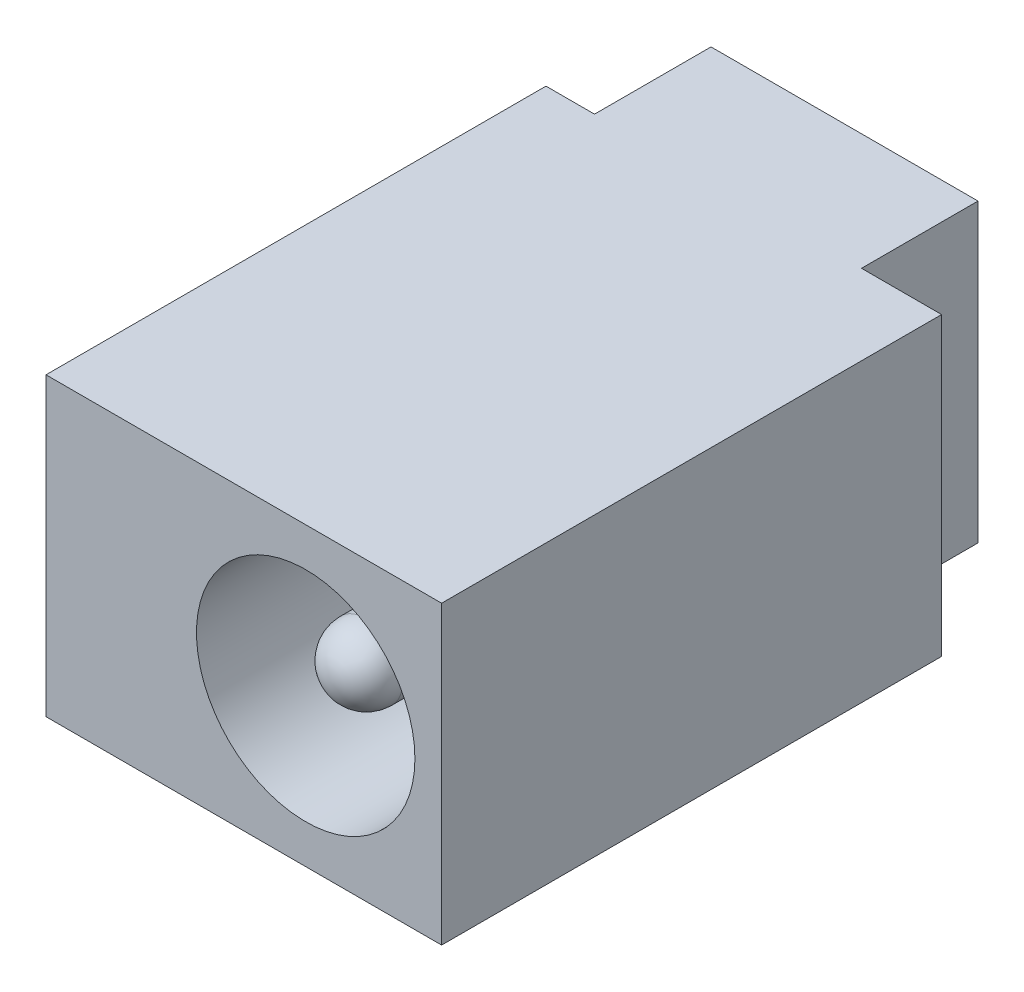
ISO-10303-21;
HEADER;
FILE_DESCRIPTION(('STEP AP214'),'2;1');
FILE_NAME('part.step','',(''),(''),'','','');
FILE_SCHEMA(('AUTOMOTIVE_DESIGN { 1 0 10303 214 1 1 1 1 }'));
ENDSEC;
DATA;
#1=APPLICATION_CONTEXT('core data for automotive mechanical design processes');
#2=APPLICATION_PROTOCOL_DEFINITION('international standard','automotive_design',2000,#1);
#3=PRODUCT_CONTEXT('',#1,'mechanical');
#4=PRODUCT('Part','Part','',(#3));
#5=PRODUCT_RELATED_PRODUCT_CATEGORY('part','',(#4));
#6=PRODUCT_DEFINITION_FORMATION('','',#4);
#7=PRODUCT_DEFINITION_CONTEXT('part definition',#1,'design');
#8=PRODUCT_DEFINITION('design','',#6,#7);
#9=PRODUCT_DEFINITION_SHAPE('','',#8);
#10=(LENGTH_UNIT() NAMED_UNIT(*) SI_UNIT(.MILLI.,.METRE.));
#11=(NAMED_UNIT(*) PLANE_ANGLE_UNIT() SI_UNIT($,.RADIAN.));
#12=(NAMED_UNIT(*) SI_UNIT($,.STERADIAN.) SOLID_ANGLE_UNIT());
#13=UNCERTAINTY_MEASURE_WITH_UNIT(LENGTH_MEASURE(1.E-05),#10,'distance_accuracy_value','');
#14=(GEOMETRIC_REPRESENTATION_CONTEXT(3) GLOBAL_UNCERTAINTY_ASSIGNED_CONTEXT((#13)) GLOBAL_UNIT_ASSIGNED_CONTEXT((#10,
#11,#12)) REPRESENTATION_CONTEXT('',''));
#15=CARTESIAN_POINT('',(0.,0.,0.));
#16=DIRECTION('',(0.,0.,1.));
#17=DIRECTION('',(1.,0.,0.));
#18=AXIS2_PLACEMENT_3D('',#15,#16,#17);
#19=CARTESIAN_POINT('',(4.075,6.1,6.35));
#20=DIRECTION('',(-1.,0.,0.));
#21=DIRECTION('',(0.,0.,1.));
#22=AXIS2_PLACEMENT_3D('',#19,#20,#21);
#23=PLANE('',#22);
#24=DIRECTION('',(0.,0.,-1.));
#25=VECTOR('',#24,1.);
#26=CARTESIAN_POINT('',(4.075,0.,6.35));
#27=LINE('',#26,#25);
#28=CARTESIAN_POINT('',(4.075,0.,6.35));
#29=VERTEX_POINT('',#28);
#30=CARTESIAN_POINT('',(4.075,0.,-3.95));
#31=VERTEX_POINT('',#30);
#32=EDGE_CURVE('E135',#29,#31,#27,.T.);
#33=ORIENTED_EDGE('',*,*,#32,.T.);
#34=DIRECTION('',(0.,-1.,0.));
#35=VECTOR('',#34,1.);
#36=CARTESIAN_POINT('',(4.075,6.1,-3.95));
#37=LINE('',#36,#35);
#38=CARTESIAN_POINT('',(4.075,6.1,-3.95));
#39=VERTEX_POINT('',#38);
#40=EDGE_CURVE('E46',#39,#31,#37,.T.);
#41=ORIENTED_EDGE('',*,*,#40,.F.);
#42=DIRECTION('',(0.,0.,-1.));
#43=VECTOR('',#42,1.);
#44=CARTESIAN_POINT('',(4.075,6.1,6.35));
#45=LINE('',#44,#43);
#46=CARTESIAN_POINT('',(4.075,6.1,6.35));
#47=VERTEX_POINT('',#46);
#48=EDGE_CURVE('E150',#47,#39,#45,.T.);
#49=ORIENTED_EDGE('',*,*,#48,.F.);
#50=DIRECTION('',(0.,-1.,0.));
#51=VECTOR('',#50,1.);
#52=CARTESIAN_POINT('',(4.075,6.1,6.35));
#53=LINE('',#52,#51);
#54=EDGE_CURVE('E131',#47,#29,#53,.T.);
#55=ORIENTED_EDGE('',*,*,#54,.T.);
#56=EDGE_LOOP('',(#33,#41,#49,#55));
#57=FACE_BOUND('',#56,.T.);
#58=ADVANCED_FACE('F37',(#57),#23,.F.);
#59=CARTESIAN_POINT('',(2.425,6.1,-3.95));
#60=DIRECTION('',(0.,0.,1.));
#61=DIRECTION('',(1.,0.,0.));
#62=AXIS2_PLACEMENT_3D('',#59,#60,#61);
#63=PLANE('',#62);
#64=DIRECTION('',(-1.,0.,0.));
#65=VECTOR('',#64,1.);
#66=CARTESIAN_POINT('',(2.425,0.,-3.95));
#67=LINE('',#66,#65);
#68=CARTESIAN_POINT('',(2.425,0.,-3.95));
#69=VERTEX_POINT('',#68);
#70=EDGE_CURVE('E138',#31,#69,#67,.T.);
#71=ORIENTED_EDGE('',*,*,#70,.T.);
#72=DIRECTION('',(0.,-1.,0.));
#73=VECTOR('',#72,1.);
#74=CARTESIAN_POINT('',(2.425,6.1,-3.95));
#75=LINE('',#74,#73);
#76=CARTESIAN_POINT('',(2.425,6.1,-3.95));
#77=VERTEX_POINT('',#76);
#78=EDGE_CURVE('E160',#77,#69,#75,.T.);
#79=ORIENTED_EDGE('',*,*,#78,.F.);
#80=DIRECTION('',(-1.,0.,0.));
#81=VECTOR('',#80,1.);
#82=CARTESIAN_POINT('',(2.425,6.1,-3.95));
#83=LINE('',#82,#81);
#84=EDGE_CURVE('E98',#39,#77,#83,.T.);
#85=ORIENTED_EDGE('',*,*,#84,.F.);
#86=ORIENTED_EDGE('',*,*,#40,.T.);
#87=EDGE_LOOP('',(#71,#79,#85,#86));
#88=FACE_BOUND('',#87,.T.);
#89=ADVANCED_FACE('F163',(#88),#63,.F.);
#90=CARTESIAN_POINT('',(2.425,6.1,-6.35));
#91=DIRECTION('',(-1.,0.,0.));
#92=DIRECTION('',(0.,0.,1.));
#93=AXIS2_PLACEMENT_3D('',#90,#91,#92);
#94=PLANE('',#93);
#95=DIRECTION('',(0.,0.,-1.));
#96=VECTOR('',#95,1.);
#97=CARTESIAN_POINT('',(2.425,0.,-6.35));
#98=LINE('',#97,#96);
#99=CARTESIAN_POINT('',(2.425,0.,-6.35));
#100=VERTEX_POINT('',#99);
#101=EDGE_CURVE('E141',#69,#100,#98,.T.);
#102=ORIENTED_EDGE('',*,*,#101,.T.);
#103=DIRECTION('',(0.,-1.,0.));
#104=VECTOR('',#103,1.);
#105=CARTESIAN_POINT('',(2.425,6.1,-6.35));
#106=LINE('',#105,#104);
#107=CARTESIAN_POINT('',(2.425,6.1,-6.35));
#108=VERTEX_POINT('',#107);
#109=EDGE_CURVE('E157',#108,#100,#106,.T.);
#110=ORIENTED_EDGE('',*,*,#109,.F.);
#111=DIRECTION('',(0.,0.,-1.));
#112=VECTOR('',#111,1.);
#113=CARTESIAN_POINT('',(2.425,6.1,-6.35));
#114=LINE('',#113,#112);
#115=EDGE_CURVE('E181',#77,#108,#114,.T.);
#116=ORIENTED_EDGE('',*,*,#115,.F.);
#117=ORIENTED_EDGE('',*,*,#78,.T.);
#118=EDGE_LOOP('',(#102,#110,#116,#117));
#119=FACE_BOUND('',#118,.T.);
#120=ADVANCED_FACE('F174',(#119),#94,.F.);
#121=CARTESIAN_POINT('',(2.425,6.1,-6.35));
#122=DIRECTION('',(0.,0.,1.));
#123=DIRECTION('',(1.,0.,0.));
#124=AXIS2_PLACEMENT_3D('',#121,#122,#123);
#125=PLANE('',#124);
#126=DIRECTION('',(-1.,0.,0.));
#127=VECTOR('',#126,1.);
#128=CARTESIAN_POINT('',(2.425,0.,-6.35));
#129=LINE('',#128,#127);
#130=CARTESIAN_POINT('',(-3.075,0.,-6.35));
#131=VERTEX_POINT('',#130);
#132=EDGE_CURVE('E143',#100,#131,#129,.T.);
#133=ORIENTED_EDGE('',*,*,#132,.T.);
#134=DIRECTION('',(0.,-1.,0.));
#135=VECTOR('',#134,1.);
#136=CARTESIAN_POINT('',(-3.075,6.1,-6.35));
#137=LINE('',#136,#135);
#138=CARTESIAN_POINT('',(-3.075,6.1,-6.35));
#139=VERTEX_POINT('',#138);
#140=EDGE_CURVE('E154',#139,#131,#137,.T.);
#141=ORIENTED_EDGE('',*,*,#140,.F.);
#142=DIRECTION('',(-1.,0.,0.));
#143=VECTOR('',#142,1.);
#144=CARTESIAN_POINT('',(2.425,6.1,-6.35));
#145=LINE('',#144,#143);
#146=EDGE_CURVE('E180',#108,#139,#145,.T.);
#147=ORIENTED_EDGE('',*,*,#146,.F.);
#148=ORIENTED_EDGE('',*,*,#109,.T.);
#149=EDGE_LOOP('',(#133,#141,#147,#148));
#150=FACE_BOUND('',#149,.T.);
#151=ADVANCED_FACE('F178',(#150),#125,.F.);
#152=CARTESIAN_POINT('',(-3.075,6.1,-3.95));
#153=DIRECTION('',(1.,0.,0.));
#154=DIRECTION('',(0.,0.,-1.));
#155=AXIS2_PLACEMENT_3D('',#152,#153,#154);
#156=PLANE('',#155);
#157=DIRECTION('',(0.,0.,1.));
#158=VECTOR('',#157,1.);
#159=CARTESIAN_POINT('',(-3.075,0.,-3.95));
#160=LINE('',#159,#158);
#161=CARTESIAN_POINT('',(-3.075,0.,-3.95));
#162=VERTEX_POINT('',#161);
#163=EDGE_CURVE('E145',#131,#162,#160,.T.);
#164=ORIENTED_EDGE('',*,*,#163,.T.);
#165=DIRECTION('',(0.,-1.,0.));
#166=VECTOR('',#165,1.);
#167=CARTESIAN_POINT('',(-3.075,6.1,-3.95));
#168=LINE('',#167,#166);
#169=CARTESIAN_POINT('',(-3.075,6.1,-3.95));
#170=VERTEX_POINT('',#169);
#171=EDGE_CURVE('E126',#170,#162,#168,.T.);
#172=ORIENTED_EDGE('',*,*,#171,.F.);
#173=DIRECTION('',(0.,0.,1.));
#174=VECTOR('',#173,1.);
#175=CARTESIAN_POINT('',(-3.075,6.1,-3.95));
#176=LINE('',#175,#174);
#177=EDGE_CURVE('E117',#139,#170,#176,.T.);
#178=ORIENTED_EDGE('',*,*,#177,.F.);
#179=ORIENTED_EDGE('',*,*,#140,.T.);
#180=EDGE_LOOP('',(#164,#172,#178,#179));
#181=FACE_BOUND('',#180,.T.);
#182=ADVANCED_FACE('F230',(#181),#156,.F.);
#183=CARTESIAN_POINT('',(-4.075,6.1,-3.95));
#184=DIRECTION('',(0.,0.,1.));
#185=DIRECTION('',(1.,0.,0.));
#186=AXIS2_PLACEMENT_3D('',#183,#184,#185);
#187=PLANE('',#186);
#188=DIRECTION('',(-1.,0.,0.));
#189=VECTOR('',#188,1.);
#190=CARTESIAN_POINT('',(-4.075,0.,-3.95));
#191=LINE('',#190,#189);
#192=CARTESIAN_POINT('',(-4.075,0.,-3.95));
#193=VERTEX_POINT('',#192);
#194=EDGE_CURVE('E125',#162,#193,#191,.T.);
#195=ORIENTED_EDGE('',*,*,#194,.T.);
#196=DIRECTION('',(0.,-1.,0.));
#197=VECTOR('',#196,1.);
#198=CARTESIAN_POINT('',(-4.075,6.1,-3.95));
#199=LINE('',#198,#197);
#200=CARTESIAN_POINT('',(-4.075,6.1,-3.95));
#201=VERTEX_POINT('',#200);
#202=EDGE_CURVE('E122',#201,#193,#199,.T.);
#203=ORIENTED_EDGE('',*,*,#202,.F.);
#204=DIRECTION('',(-1.,0.,0.));
#205=VECTOR('',#204,1.);
#206=CARTESIAN_POINT('',(-4.075,6.1,-3.95));
#207=LINE('',#206,#205);
#208=EDGE_CURVE('E111',#170,#201,#207,.T.);
#209=ORIENTED_EDGE('',*,*,#208,.F.);
#210=ORIENTED_EDGE('',*,*,#171,.T.);
#211=EDGE_LOOP('',(#195,#203,#209,#210));
#212=FACE_BOUND('',#211,.T.);
#213=ADVANCED_FACE('F123',(#212),#187,.F.);
#214=CARTESIAN_POINT('',(-4.075,6.1,6.35));
#215=DIRECTION('',(1.,0.,0.));
#216=DIRECTION('',(0.,0.,-1.));
#217=AXIS2_PLACEMENT_3D('',#214,#215,#216);
#218=PLANE('',#217);
#219=DIRECTION('',(0.,0.,1.));
#220=VECTOR('',#219,1.);
#221=CARTESIAN_POINT('',(-4.075,0.,6.35));
#222=LINE('',#221,#220);
#223=CARTESIAN_POINT('',(-4.075,0.,6.35));
#224=VERTEX_POINT('',#223);
#225=EDGE_CURVE('E83',#193,#224,#222,.T.);
#226=ORIENTED_EDGE('',*,*,#225,.T.);
#227=DIRECTION('',(0.,-1.,0.));
#228=VECTOR('',#227,1.);
#229=CARTESIAN_POINT('',(-4.075,6.1,6.35));
#230=LINE('',#229,#228);
#231=CARTESIAN_POINT('',(-4.075,6.1,6.35));
#232=VERTEX_POINT('',#231);
#233=EDGE_CURVE('E127',#232,#224,#230,.T.);
#234=ORIENTED_EDGE('',*,*,#233,.F.);
#235=DIRECTION('',(0.,0.,1.));
#236=VECTOR('',#235,1.);
#237=CARTESIAN_POINT('',(-4.075,6.1,6.35));
#238=LINE('',#237,#236);
#239=EDGE_CURVE('E115',#201,#232,#238,.T.);
#240=ORIENTED_EDGE('',*,*,#239,.F.);
#241=ORIENTED_EDGE('',*,*,#202,.T.);
#242=EDGE_LOOP('',(#226,#234,#240,#241));
#243=FACE_BOUND('',#242,.T.);
#244=ADVANCED_FACE('F129',(#243),#218,.F.);
#245=CARTESIAN_POINT('',(4.075,6.1,6.35));
#246=DIRECTION('',(0.,0.,-1.));
#247=DIRECTION('',(-1.,0.,0.));
#248=AXIS2_PLACEMENT_3D('',#245,#246,#247);
#249=PLANE('',#248);
#250=CARTESIAN_POINT('',(1.275,3.05,6.35));
#251=DIRECTION('',(0.,0.,1.));
#252=DIRECTION('',(1.,0.,0.));
#253=AXIS2_PLACEMENT_3D('',#250,#251,#252);
#254=CIRCLE('',#253,2.25);
#255=CARTESIAN_POINT('',(3.525,3.05,6.35));
#256=VERTEX_POINT('',#255);
#257=EDGE_CURVE('E187',#256,#256,#254,.T.);
#258=ORIENTED_EDGE('',*,*,#257,.F.);
#259=EDGE_LOOP('',(#258));
#260=FACE_BOUND('',#259,.T.);
#261=DIRECTION('',(1.,0.,0.));
#262=VECTOR('',#261,1.);
#263=CARTESIAN_POINT('',(4.075,0.,6.35));
#264=LINE('',#263,#262);
#265=EDGE_CURVE('E89',#224,#29,#264,.T.);
#266=ORIENTED_EDGE('',*,*,#265,.T.);
#267=ORIENTED_EDGE('',*,*,#54,.F.);
#268=DIRECTION('',(1.,0.,0.));
#269=VECTOR('',#268,1.);
#270=CARTESIAN_POINT('',(4.075,6.1,6.35));
#271=LINE('',#270,#269);
#272=EDGE_CURVE('E54',#232,#47,#271,.T.);
#273=ORIENTED_EDGE('',*,*,#272,.F.);
#274=ORIENTED_EDGE('',*,*,#233,.T.);
#275=EDGE_LOOP('',(#266,#267,#273,#274));
#276=FACE_BOUND('',#275,.T.);
#277=ADVANCED_FACE('F210',(#260,#276),#249,.F.);
#278=CARTESIAN_POINT('',(0.,6.1,0.));
#279=DIRECTION('',(0.,-1.,0.));
#280=DIRECTION('',(0.,0.,-1.));
#281=AXIS2_PLACEMENT_3D('',#278,#279,#280);
#282=PLANE('',#281);
#283=ORIENTED_EDGE('',*,*,#48,.T.);
#284=ORIENTED_EDGE('',*,*,#84,.T.);
#285=ORIENTED_EDGE('',*,*,#115,.T.);
#286=ORIENTED_EDGE('',*,*,#146,.T.);
#287=ORIENTED_EDGE('',*,*,#177,.T.);
#288=ORIENTED_EDGE('',*,*,#208,.T.);
#289=ORIENTED_EDGE('',*,*,#239,.T.);
#290=ORIENTED_EDGE('',*,*,#272,.T.);
#291=EDGE_LOOP('',(#283,#284,#285,#286,#287,#288,#289,#290));
#292=FACE_BOUND('',#291,.T.);
#293=ADVANCED_FACE('F113',(#292),#282,.F.);
#294=CARTESIAN_POINT('',(0.,0.,0.));
#295=DIRECTION('',(0.,-1.,0.));
#296=DIRECTION('',(0.,0.,-1.));
#297=AXIS2_PLACEMENT_3D('',#294,#295,#296);
#298=PLANE('',#297);
#299=ORIENTED_EDGE('',*,*,#32,.F.);
#300=ORIENTED_EDGE('',*,*,#265,.F.);
#301=ORIENTED_EDGE('',*,*,#225,.F.);
#302=ORIENTED_EDGE('',*,*,#194,.F.);
#303=ORIENTED_EDGE('',*,*,#163,.F.);
#304=ORIENTED_EDGE('',*,*,#132,.F.);
#305=ORIENTED_EDGE('',*,*,#101,.F.);
#306=ORIENTED_EDGE('',*,*,#70,.F.);
#307=EDGE_LOOP('',(#299,#300,#301,#302,#303,#304,#305,#306));
#308=FACE_BOUND('',#307,.T.);
#309=ADVANCED_FACE('F168',(#308),#298,.T.);
#310=CARTESIAN_POINT('',(1.275,3.05,-1.65));
#311=DIRECTION('',(0.,0.,1.));
#312=DIRECTION('',(1.,0.,0.));
#313=AXIS2_PLACEMENT_3D('',#310,#311,#312);
#314=CYLINDRICAL_SURFACE('',#313,2.25);
#315=CARTESIAN_POINT('',(1.275,3.05,-1.65));
#316=DIRECTION('',(0.,0.,1.));
#317=DIRECTION('',(1.,0.,0.));
#318=AXIS2_PLACEMENT_3D('',#315,#316,#317);
#319=CIRCLE('',#318,2.25);
#320=CARTESIAN_POINT('',(3.525,3.05,-1.65));
#321=VERTEX_POINT('',#320);
#322=EDGE_CURVE('E139',#321,#321,#319,.T.);
#323=ORIENTED_EDGE('',*,*,#322,.F.);
#324=EDGE_LOOP('',(#323));
#325=FACE_BOUND('',#324,.T.);
#326=ORIENTED_EDGE('',*,*,#257,.T.);
#327=EDGE_LOOP('',(#326));
#328=FACE_BOUND('',#327,.T.);
#329=ADVANCED_FACE('F201',(#325,#328),#314,.F.);
#330=CARTESIAN_POINT('',(1.275,3.05,-1.65));
#331=DIRECTION('',(0.,0.,1.));
#332=DIRECTION('',(1.,0.,0.));
#333=AXIS2_PLACEMENT_3D('',#330,#331,#332);
#334=PLANE('',#333);
#335=CARTESIAN_POINT('',(1.275,3.05,-1.65));
#336=DIRECTION('',(0.,0.,1.));
#337=DIRECTION('',(1.,0.,0.));
#338=AXIS2_PLACEMENT_3D('',#335,#336,#337);
#339=CIRCLE('',#338,0.75);
#340=CARTESIAN_POINT('',(2.025,3.05,-1.65));
#341=VERTEX_POINT('',#340);
#342=EDGE_CURVE('E190',#341,#341,#339,.T.);
#343=ORIENTED_EDGE('',*,*,#342,.F.);
#344=EDGE_LOOP('',(#343));
#345=FACE_BOUND('',#344,.T.);
#346=ORIENTED_EDGE('',*,*,#322,.T.);
#347=EDGE_LOOP('',(#346));
#348=FACE_BOUND('',#347,.T.);
#349=ADVANCED_FACE('F198',(#345,#348),#334,.T.);
#350=CARTESIAN_POINT('',(1.275,3.05,5.85));
#351=DIRECTION('',(0.,0.,-1.));
#352=DIRECTION('',(-1.,0.,0.));
#353=AXIS2_PLACEMENT_3D('',#350,#351,#352);
#354=CYLINDRICAL_SURFACE('',#353,0.75);
#355=CARTESIAN_POINT('',(1.275,3.05,5.1));
#356=DIRECTION('',(0.,0.,-1.));
#357=DIRECTION('',(-1.,0.,0.));
#358=AXIS2_PLACEMENT_3D('',#355,#356,#357);
#359=CIRCLE('',#358,0.75);
#360=CARTESIAN_POINT('',(0.525000000000001,3.05,5.1));
#361=VERTEX_POINT('',#360);
#362=EDGE_CURVE('E11',#361,#361,#359,.T.);
#363=ORIENTED_EDGE('',*,*,#362,.T.);
#364=EDGE_LOOP('',(#363));
#365=FACE_BOUND('',#364,.T.);
#366=ORIENTED_EDGE('',*,*,#342,.T.);
#367=EDGE_LOOP('',(#366));
#368=FACE_BOUND('',#367,.T.);
#369=ADVANCED_FACE('F196',(#365,#368),#354,.T.);
#370=CARTESIAN_POINT('',(1.275,3.05,5.1));
#371=DIRECTION('',(0.,0.,1.));
#372=DIRECTION('',(1.,0.,0.));
#373=AXIS2_PLACEMENT_3D('',#370,#371,#372);
#374=SPHERICAL_SURFACE('',#373,0.75);
#375=ORIENTED_EDGE('',*,*,#362,.F.);
#376=EDGE_LOOP('',(#375));
#377=FACE_BOUND('',#376,.T.);
#378=ADVANCED_FACE('F39',(#377),#374,.T.);
#379=CLOSED_SHELL('',(#58,#89,#120,#151,#182,#213,#244,#277,#293,#309,#329,#349,#369,#378));
#380=MANIFOLD_SOLID_BREP('B2',#379);
#381=ADVANCED_BREP_SHAPE_REPRESENTATION('',(#18,#380),#14);
#382=SHAPE_DEFINITION_REPRESENTATION(#9,#381);
ENDSEC;
END-ISO-10303-21;
